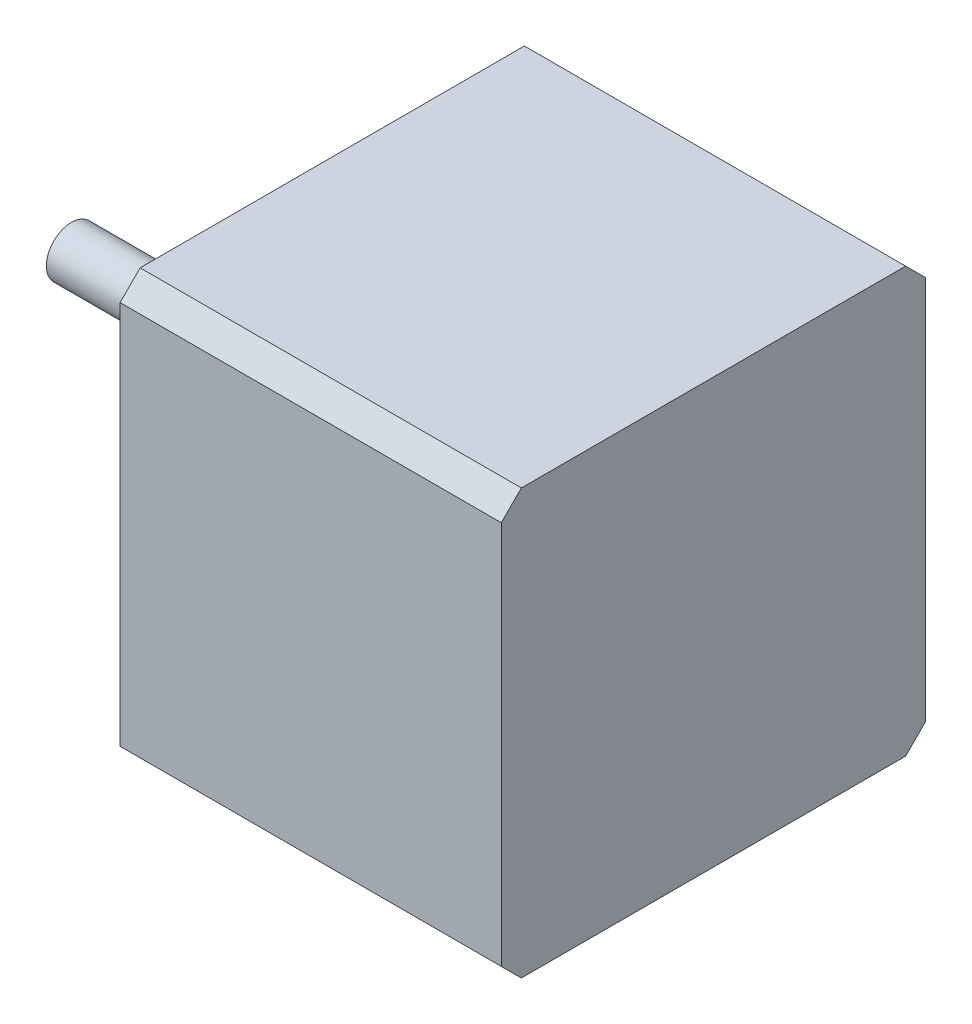
ISO-10303-21;
HEADER;
FILE_DESCRIPTION(('STEP AP214'),'2;1');
FILE_NAME('part.step','',(''),(''),'','','');
FILE_SCHEMA(('AUTOMOTIVE_DESIGN { 1 0 10303 214 1 1 1 1 }'));
ENDSEC;
DATA;
#1=APPLICATION_CONTEXT('core data for automotive mechanical design processes');
#2=APPLICATION_PROTOCOL_DEFINITION('international standard','automotive_design',2000,#1);
#3=PRODUCT_CONTEXT('',#1,'mechanical');
#4=PRODUCT('Part','Part','',(#3));
#5=PRODUCT_RELATED_PRODUCT_CATEGORY('part','',(#4));
#6=PRODUCT_DEFINITION_FORMATION('','',#4);
#7=PRODUCT_DEFINITION_CONTEXT('part definition',#1,'design');
#8=PRODUCT_DEFINITION('design','',#6,#7);
#9=PRODUCT_DEFINITION_SHAPE('','',#8);
#10=(LENGTH_UNIT() NAMED_UNIT(*) SI_UNIT(.MILLI.,.METRE.));
#11=(NAMED_UNIT(*) PLANE_ANGLE_UNIT() SI_UNIT($,.RADIAN.));
#12=(NAMED_UNIT(*) SI_UNIT($,.STERADIAN.) SOLID_ANGLE_UNIT());
#13=UNCERTAINTY_MEASURE_WITH_UNIT(LENGTH_MEASURE(1.E-05),#10,'distance_accuracy_value','');
#14=(GEOMETRIC_REPRESENTATION_CONTEXT(3) GLOBAL_UNCERTAINTY_ASSIGNED_CONTEXT((#13)) GLOBAL_UNIT_ASSIGNED_CONTEXT((#10,
#11,#12)) REPRESENTATION_CONTEXT('',''));
#15=CARTESIAN_POINT('',(0.,0.,0.));
#16=DIRECTION('',(0.,0.,1.));
#17=DIRECTION('',(1.,0.,0.));
#18=AXIS2_PLACEMENT_3D('',#15,#16,#17);
#19=CARTESIAN_POINT('',(38.,40.3,0.));
#20=DIRECTION('',(0.,0.707106781186547,0.707106781186548));
#21=DIRECTION('',(0.,-0.707106781186548,0.707106781186547));
#22=AXIS2_PLACEMENT_3D('',#19,#20,#21);
#23=PLANE('',#22);
#24=DIRECTION('',(0.,0.707106781186548,-0.707106781186547));
#25=VECTOR('',#24,1.);
#26=CARTESIAN_POINT('',(0.,40.3,0.));
#27=LINE('',#26,#25);
#28=CARTESIAN_POINT('',(0.,40.3,0.));
#29=VERTEX_POINT('',#28);
#30=CARTESIAN_POINT('',(0.,42.3,-2.));
#31=VERTEX_POINT('',#30);
#32=EDGE_CURVE('E133',#29,#31,#27,.T.);
#33=ORIENTED_EDGE('',*,*,#32,.F.);
#34=DIRECTION('',(-1.,0.,0.));
#35=VECTOR('',#34,1.);
#36=CARTESIAN_POINT('',(38.,40.3,0.));
#37=LINE('',#36,#35);
#38=CARTESIAN_POINT('',(38.,40.3,0.));
#39=VERTEX_POINT('',#38);
#40=EDGE_CURVE('E51',#39,#29,#37,.T.);
#41=ORIENTED_EDGE('',*,*,#40,.F.);
#42=DIRECTION('',(0.,0.707106781186548,-0.707106781186547));
#43=VECTOR('',#42,1.);
#44=CARTESIAN_POINT('',(38.,40.3,0.));
#45=LINE('',#44,#43);
#46=CARTESIAN_POINT('',(38.,42.3,-2.));
#47=VERTEX_POINT('',#46);
#48=EDGE_CURVE('E154',#39,#47,#45,.T.);
#49=ORIENTED_EDGE('',*,*,#48,.T.);
#50=DIRECTION('',(-1.,0.,0.));
#51=VECTOR('',#50,1.);
#52=CARTESIAN_POINT('',(38.,42.3,-2.));
#53=LINE('',#52,#51);
#54=EDGE_CURVE('E91',#47,#31,#53,.T.);
#55=ORIENTED_EDGE('',*,*,#54,.T.);
#56=EDGE_LOOP('',(#33,#41,#49,#55));
#57=FACE_BOUND('',#56,.T.);
#58=ADVANCED_FACE('F34',(#57),#23,.T.);
#59=CARTESIAN_POINT('',(38.,2.,0.));
#60=DIRECTION('',(0.,0.,1.));
#61=DIRECTION('',(1.,0.,0.));
#62=AXIS2_PLACEMENT_3D('',#59,#60,#61);
#63=PLANE('',#62);
#64=DIRECTION('',(0.,1.,0.));
#65=VECTOR('',#64,1.);
#66=CARTESIAN_POINT('',(0.,2.,0.));
#67=LINE('',#66,#65);
#68=CARTESIAN_POINT('',(0.,2.,0.));
#69=VERTEX_POINT('',#68);
#70=EDGE_CURVE('E151',#69,#29,#67,.T.);
#71=ORIENTED_EDGE('',*,*,#70,.F.);
#72=DIRECTION('',(-1.,0.,0.));
#73=VECTOR('',#72,1.);
#74=CARTESIAN_POINT('',(38.,2.,0.));
#75=LINE('',#74,#73);
#76=CARTESIAN_POINT('',(38.,2.,0.));
#77=VERTEX_POINT('',#76);
#78=EDGE_CURVE('E79',#77,#69,#75,.T.);
#79=ORIENTED_EDGE('',*,*,#78,.F.);
#80=DIRECTION('',(0.,1.,0.));
#81=VECTOR('',#80,1.);
#82=CARTESIAN_POINT('',(38.,2.,0.));
#83=LINE('',#82,#81);
#84=EDGE_CURVE('E113',#77,#39,#83,.T.);
#85=ORIENTED_EDGE('',*,*,#84,.T.);
#86=ORIENTED_EDGE('',*,*,#40,.T.);
#87=EDGE_LOOP('',(#71,#79,#85,#86));
#88=FACE_BOUND('',#87,.T.);
#89=ADVANCED_FACE('F185',(#88),#63,.T.);
#90=CARTESIAN_POINT('',(38.,2.,0.));
#91=DIRECTION('',(0.,0.707106781186548,-0.707106781186548));
#92=DIRECTION('',(0.,0.707106781186548,0.707106781186548));
#93=AXIS2_PLACEMENT_3D('',#90,#91,#92);
#94=PLANE('',#93);
#95=DIRECTION('',(0.,-0.707106781186548,-0.707106781186548));
#96=VECTOR('',#95,1.);
#97=CARTESIAN_POINT('',(0.,2.,0.));
#98=LINE('',#97,#96);
#99=CARTESIAN_POINT('',(0.,0.,-2.));
#100=VERTEX_POINT('',#99);
#101=EDGE_CURVE('E118',#69,#100,#98,.T.);
#102=ORIENTED_EDGE('',*,*,#101,.T.);
#103=DIRECTION('',(-1.,0.,0.));
#104=VECTOR('',#103,1.);
#105=CARTESIAN_POINT('',(38.,0.,-2.));
#106=LINE('',#105,#104);
#107=CARTESIAN_POINT('',(38.,0.,-2.));
#108=VERTEX_POINT('',#107);
#109=EDGE_CURVE('E116',#108,#100,#106,.T.);
#110=ORIENTED_EDGE('',*,*,#109,.F.);
#111=DIRECTION('',(0.,-0.707106781186548,-0.707106781186548));
#112=VECTOR('',#111,1.);
#113=CARTESIAN_POINT('',(38.,2.,0.));
#114=LINE('',#113,#112);
#115=EDGE_CURVE('E107',#77,#108,#114,.T.);
#116=ORIENTED_EDGE('',*,*,#115,.F.);
#117=ORIENTED_EDGE('',*,*,#78,.T.);
#118=EDGE_LOOP('',(#102,#110,#116,#117));
#119=FACE_BOUND('',#118,.T.);
#120=ADVANCED_FACE('F117',(#119),#94,.F.);
#121=CARTESIAN_POINT('',(38.,0.,-2.));
#122=DIRECTION('',(0.,1.,0.));
#123=DIRECTION('',(0.,0.,1.));
#124=AXIS2_PLACEMENT_3D('',#121,#122,#123);
#125=PLANE('',#124);
#126=DIRECTION('',(0.,0.,-1.));
#127=VECTOR('',#126,1.);
#128=CARTESIAN_POINT('',(0.,0.,-2.));
#129=LINE('',#128,#127);
#130=CARTESIAN_POINT('',(0.,0.,-40.3));
#131=VERTEX_POINT('',#130);
#132=EDGE_CURVE('E148',#100,#131,#129,.T.);
#133=ORIENTED_EDGE('',*,*,#132,.T.);
#134=DIRECTION('',(-1.,0.,0.));
#135=VECTOR('',#134,1.);
#136=CARTESIAN_POINT('',(38.,0.,-40.3));
#137=LINE('',#136,#135);
#138=CARTESIAN_POINT('',(38.,0.,-40.3));
#139=VERTEX_POINT('',#138);
#140=EDGE_CURVE('E121',#139,#131,#137,.T.);
#141=ORIENTED_EDGE('',*,*,#140,.F.);
#142=DIRECTION('',(0.,0.,-1.));
#143=VECTOR('',#142,1.);
#144=CARTESIAN_POINT('',(38.,0.,-2.));
#145=LINE('',#144,#143);
#146=EDGE_CURVE('E111',#108,#139,#145,.T.);
#147=ORIENTED_EDGE('',*,*,#146,.F.);
#148=ORIENTED_EDGE('',*,*,#109,.T.);
#149=EDGE_LOOP('',(#133,#141,#147,#148));
#150=FACE_BOUND('',#149,.T.);
#151=ADVANCED_FACE('F123',(#150),#125,.F.);
#152=CARTESIAN_POINT('',(38.,0.,-40.3));
#153=DIRECTION('',(0.,0.707106781186548,0.707106781186547));
#154=DIRECTION('',(0.,-0.707106781186547,0.707106781186548));
#155=AXIS2_PLACEMENT_3D('',#152,#153,#154);
#156=PLANE('',#155);
#157=DIRECTION('',(0.,0.707106781186547,-0.707106781186548));
#158=VECTOR('',#157,1.);
#159=CARTESIAN_POINT('',(0.,0.,-40.3));
#160=LINE('',#159,#158);
#161=CARTESIAN_POINT('',(0.,2.,-42.3));
#162=VERTEX_POINT('',#161);
#163=EDGE_CURVE('E146',#131,#162,#160,.T.);
#164=ORIENTED_EDGE('',*,*,#163,.T.);
#165=DIRECTION('',(-1.,0.,0.));
#166=VECTOR('',#165,1.);
#167=CARTESIAN_POINT('',(38.,2.,-42.3));
#168=LINE('',#167,#166);
#169=CARTESIAN_POINT('',(38.,2.,-42.3));
#170=VERTEX_POINT('',#169);
#171=EDGE_CURVE('E158',#170,#162,#168,.T.);
#172=ORIENTED_EDGE('',*,*,#171,.F.);
#173=DIRECTION('',(0.,0.707106781186547,-0.707106781186548));
#174=VECTOR('',#173,1.);
#175=CARTESIAN_POINT('',(38.,0.,-40.3));
#176=LINE('',#175,#174);
#177=EDGE_CURVE('E126',#139,#170,#176,.T.);
#178=ORIENTED_EDGE('',*,*,#177,.F.);
#179=ORIENTED_EDGE('',*,*,#140,.T.);
#180=EDGE_LOOP('',(#164,#172,#178,#179));
#181=FACE_BOUND('',#180,.T.);
#182=ADVANCED_FACE('F201',(#181),#156,.F.);
#183=CARTESIAN_POINT('',(38.,2.,-42.3));
#184=DIRECTION('',(0.,0.,1.));
#185=DIRECTION('',(1.,0.,0.));
#186=AXIS2_PLACEMENT_3D('',#183,#184,#185);
#187=PLANE('',#186);
#188=DIRECTION('',(0.,1.,0.));
#189=VECTOR('',#188,1.);
#190=CARTESIAN_POINT('',(0.,2.,-42.3));
#191=LINE('',#190,#189);
#192=CARTESIAN_POINT('',(0.,40.3,-42.3));
#193=VERTEX_POINT('',#192);
#194=EDGE_CURVE('E143',#162,#193,#191,.T.);
#195=ORIENTED_EDGE('',*,*,#194,.T.);
#196=DIRECTION('',(-1.,0.,0.));
#197=VECTOR('',#196,1.);
#198=CARTESIAN_POINT('',(38.,40.3,-42.3));
#199=LINE('',#198,#197);
#200=CARTESIAN_POINT('',(38.,40.3,-42.3));
#201=VERTEX_POINT('',#200);
#202=EDGE_CURVE('E161',#201,#193,#199,.T.);
#203=ORIENTED_EDGE('',*,*,#202,.F.);
#204=DIRECTION('',(0.,1.,0.));
#205=VECTOR('',#204,1.);
#206=CARTESIAN_POINT('',(38.,2.,-42.3));
#207=LINE('',#206,#205);
#208=EDGE_CURVE('E128',#170,#201,#207,.T.);
#209=ORIENTED_EDGE('',*,*,#208,.F.);
#210=ORIENTED_EDGE('',*,*,#171,.T.);
#211=EDGE_LOOP('',(#195,#203,#209,#210));
#212=FACE_BOUND('',#211,.T.);
#213=ADVANCED_FACE('F197',(#212),#187,.F.);
#214=CARTESIAN_POINT('',(38.,42.3,-40.3));
#215=DIRECTION('',(0.,0.707106781186548,-0.707106781186548));
#216=DIRECTION('',(0.,0.707106781186548,0.707106781186548));
#217=AXIS2_PLACEMENT_3D('',#214,#215,#216);
#218=PLANE('',#217);
#219=DIRECTION('',(0.,-0.707106781186547,-0.707106781186547));
#220=VECTOR('',#219,1.);
#221=CARTESIAN_POINT('',(0.,42.3,-40.3));
#222=LINE('',#221,#220);
#223=CARTESIAN_POINT('',(0.,42.3,-40.3));
#224=VERTEX_POINT('',#223);
#225=EDGE_CURVE('E140',#224,#193,#222,.T.);
#226=ORIENTED_EDGE('',*,*,#225,.F.);
#227=DIRECTION('',(-1.,0.,0.));
#228=VECTOR('',#227,1.);
#229=CARTESIAN_POINT('',(38.,42.3,-40.3));
#230=LINE('',#229,#228);
#231=CARTESIAN_POINT('',(38.,42.3,-40.3));
#232=VERTEX_POINT('',#231);
#233=EDGE_CURVE('E163',#232,#224,#230,.T.);
#234=ORIENTED_EDGE('',*,*,#233,.F.);
#235=DIRECTION('',(0.,-0.707106781186547,-0.707106781186547));
#236=VECTOR('',#235,1.);
#237=CARTESIAN_POINT('',(38.,42.3,-40.3));
#238=LINE('',#237,#236);
#239=EDGE_CURVE('E292',#232,#201,#238,.T.);
#240=ORIENTED_EDGE('',*,*,#239,.T.);
#241=ORIENTED_EDGE('',*,*,#202,.T.);
#242=EDGE_LOOP('',(#226,#234,#240,#241));
#243=FACE_BOUND('',#242,.T.);
#244=ADVANCED_FACE('F194',(#243),#218,.T.);
#245=CARTESIAN_POINT('',(38.,42.3,-2.));
#246=DIRECTION('',(0.,1.,0.));
#247=DIRECTION('',(0.,0.,1.));
#248=AXIS2_PLACEMENT_3D('',#245,#246,#247);
#249=PLANE('',#248);
#250=DIRECTION('',(0.,0.,-1.));
#251=VECTOR('',#250,1.);
#252=CARTESIAN_POINT('',(0.,42.3,-2.));
#253=LINE('',#252,#251);
#254=EDGE_CURVE('E136',#31,#224,#253,.T.);
#255=ORIENTED_EDGE('',*,*,#254,.F.);
#256=ORIENTED_EDGE('',*,*,#54,.F.);
#257=DIRECTION('',(0.,0.,-1.));
#258=VECTOR('',#257,1.);
#259=CARTESIAN_POINT('',(38.,42.3,-2.));
#260=LINE('',#259,#258);
#261=EDGE_CURVE('E290',#47,#232,#260,.T.);
#262=ORIENTED_EDGE('',*,*,#261,.T.);
#263=ORIENTED_EDGE('',*,*,#233,.T.);
#264=EDGE_LOOP('',(#255,#256,#262,#263));
#265=FACE_BOUND('',#264,.T.);
#266=ADVANCED_FACE('F191',(#265),#249,.T.);
#267=CARTESIAN_POINT('',(38.,0.,0.));
#268=DIRECTION('',(-1.,0.,0.));
#269=DIRECTION('',(0.,0.,1.));
#270=AXIS2_PLACEMENT_3D('',#267,#268,#269);
#271=PLANE('',#270);
#272=ORIENTED_EDGE('',*,*,#48,.F.);
#273=ORIENTED_EDGE('',*,*,#84,.F.);
#274=ORIENTED_EDGE('',*,*,#115,.T.);
#275=ORIENTED_EDGE('',*,*,#146,.T.);
#276=ORIENTED_EDGE('',*,*,#177,.T.);
#277=ORIENTED_EDGE('',*,*,#208,.T.);
#278=ORIENTED_EDGE('',*,*,#239,.F.);
#279=ORIENTED_EDGE('',*,*,#261,.F.);
#280=EDGE_LOOP('',(#272,#273,#274,#275,#276,#277,#278,#279));
#281=FACE_BOUND('',#280,.T.);
#282=ADVANCED_FACE('F109',(#281),#271,.F.);
#283=CARTESIAN_POINT('',(0.,0.,0.));
#284=DIRECTION('',(-1.,0.,0.));
#285=DIRECTION('',(0.,0.,1.));
#286=AXIS2_PLACEMENT_3D('',#283,#284,#285);
#287=PLANE('',#286);
#288=CARTESIAN_POINT('',(0.,5.65,-5.65));
#289=DIRECTION('',(-1.,0.,0.));
#290=DIRECTION('',(0.,0.,-1.));
#291=AXIS2_PLACEMENT_3D('',#288,#289,#290);
#292=CIRCLE('',#291,1.5);
#293=CARTESIAN_POINT('',(0.,5.65,-7.15));
#294=VERTEX_POINT('',#293);
#295=EDGE_CURVE('E259',#294,#294,#292,.T.);
#296=ORIENTED_EDGE('',*,*,#295,.F.);
#297=EDGE_LOOP('',(#296));
#298=FACE_BOUND('',#297,.T.);
#299=CARTESIAN_POINT('',(0.,5.65000000000015,-36.6500000000002));
#300=DIRECTION('',(-1.,0.,0.));
#301=DIRECTION('',(0.,1.,0.));
#302=AXIS2_PLACEMENT_3D('',#299,#300,#301);
#303=CIRCLE('',#302,1.5);
#304=CARTESIAN_POINT('',(0.,7.15000000000016,-36.6500000000001));
#305=VERTEX_POINT('',#304);
#306=EDGE_CURVE('E270',#305,#305,#303,.T.);
#307=ORIENTED_EDGE('',*,*,#306,.F.);
#308=EDGE_LOOP('',(#307));
#309=FACE_BOUND('',#308,.T.);
#310=CARTESIAN_POINT('',(0.,36.6499999999999,-5.64999999999994));
#311=DIRECTION('',(-1.,0.,0.));
#312=DIRECTION('',(0.,-1.,0.));
#313=AXIS2_PLACEMENT_3D('',#310,#311,#312);
#314=CIRCLE('',#313,1.5);
#315=CARTESIAN_POINT('',(0.,35.1499999999999,-5.64999999999995));
#316=VERTEX_POINT('',#315);
#317=EDGE_CURVE('E258',#316,#316,#314,.T.);
#318=ORIENTED_EDGE('',*,*,#317,.F.);
#319=EDGE_LOOP('',(#318));
#320=FACE_BOUND('',#319,.T.);
#321=CARTESIAN_POINT('',(0.,36.65,-36.65));
#322=DIRECTION('',(-1.,0.,0.));
#323=DIRECTION('',(0.,0.,1.));
#324=AXIS2_PLACEMENT_3D('',#321,#322,#323);
#325=CIRCLE('',#324,1.5);
#326=CARTESIAN_POINT('',(0.,36.65,-35.15));
#327=VERTEX_POINT('',#326);
#328=EDGE_CURVE('E274',#327,#327,#325,.T.);
#329=ORIENTED_EDGE('',*,*,#328,.F.);
#330=EDGE_LOOP('',(#329));
#331=FACE_BOUND('',#330,.T.);
#332=CARTESIAN_POINT('',(0.,21.15,-21.15));
#333=DIRECTION('',(-1.,0.,0.));
#334=DIRECTION('',(0.,0.,1.));
#335=AXIS2_PLACEMENT_3D('',#332,#333,#334);
#336=CIRCLE('',#335,11.);
#337=CARTESIAN_POINT('',(0.,21.15,-10.15));
#338=VERTEX_POINT('',#337);
#339=EDGE_CURVE('E137',#338,#338,#336,.T.);
#340=ORIENTED_EDGE('',*,*,#339,.F.);
#341=EDGE_LOOP('',(#340));
#342=FACE_BOUND('',#341,.T.);
#343=ORIENTED_EDGE('',*,*,#32,.T.);
#344=ORIENTED_EDGE('',*,*,#254,.T.);
#345=ORIENTED_EDGE('',*,*,#225,.T.);
#346=ORIENTED_EDGE('',*,*,#194,.F.);
#347=ORIENTED_EDGE('',*,*,#163,.F.);
#348=ORIENTED_EDGE('',*,*,#132,.F.);
#349=ORIENTED_EDGE('',*,*,#101,.F.);
#350=ORIENTED_EDGE('',*,*,#70,.T.);
#351=EDGE_LOOP('',(#343,#344,#345,#346,#347,#348,#349,#350));
#352=FACE_BOUND('',#351,.T.);
#353=ADVANCED_FACE('F210',(#298,#309,#320,#331,#342,#352),#287,.T.);
#354=CARTESIAN_POINT('',(-2.,21.15,-21.15));
#355=DIRECTION('',(1.,0.,0.));
#356=DIRECTION('',(0.,0.,-1.));
#357=AXIS2_PLACEMENT_3D('',#354,#355,#356);
#358=CYLINDRICAL_SURFACE('',#357,11.);
#359=CARTESIAN_POINT('',(-1.,21.15,-21.15));
#360=DIRECTION('',(-1.,0.,0.));
#361=DIRECTION('',(0.,0.,1.));
#362=AXIS2_PLACEMENT_3D('',#359,#360,#361);
#363=CIRCLE('',#362,11.);
#364=CARTESIAN_POINT('',(-1.,21.15,-10.15));
#365=VERTEX_POINT('',#364);
#366=EDGE_CURVE('E11',#365,#365,#363,.F.);
#367=ORIENTED_EDGE('',*,*,#366,.T.);
#368=EDGE_LOOP('',(#367));
#369=FACE_BOUND('',#368,.T.);
#370=ORIENTED_EDGE('',*,*,#339,.T.);
#371=EDGE_LOOP('',(#370));
#372=FACE_BOUND('',#371,.T.);
#373=ADVANCED_FACE('F180',(#369,#372),#358,.T.);
#374=CARTESIAN_POINT('',(-2.,21.15,-21.15));
#375=DIRECTION('',(-1.,0.,0.));
#376=DIRECTION('',(0.,0.,1.));
#377=AXIS2_PLACEMENT_3D('',#374,#375,#376);
#378=PLANE('',#377);
#379=CARTESIAN_POINT('',(-2.,21.15,-21.15));
#380=DIRECTION('',(-1.,0.,0.));
#381=DIRECTION('',(0.,0.,1.));
#382=AXIS2_PLACEMENT_3D('',#379,#380,#381);
#383=CIRCLE('',#382,2.5);
#384=CARTESIAN_POINT('',(-2.,21.15,-18.65));
#385=VERTEX_POINT('',#384);
#386=EDGE_CURVE('E279',#385,#385,#383,.T.);
#387=ORIENTED_EDGE('',*,*,#386,.F.);
#388=EDGE_LOOP('',(#387));
#389=FACE_BOUND('',#388,.T.);
#390=CARTESIAN_POINT('',(-2.,21.15,-21.15));
#391=DIRECTION('',(-1.,0.,0.));
#392=DIRECTION('',(0.,0.,1.));
#393=AXIS2_PLACEMENT_3D('',#390,#391,#392);
#394=CIRCLE('',#393,10.);
#395=CARTESIAN_POINT('',(-2.,21.15,-11.15));
#396=VERTEX_POINT('',#395);
#397=EDGE_CURVE('E43',#396,#396,#394,.T.);
#398=ORIENTED_EDGE('',*,*,#397,.T.);
#399=EDGE_LOOP('',(#398));
#400=FACE_BOUND('',#399,.T.);
#401=ADVANCED_FACE('F168',(#389,#400),#378,.T.);
#402=CARTESIAN_POINT('',(-1.,21.15,-21.15));
#403=DIRECTION('',(-1.,0.,0.));
#404=DIRECTION('',(0.,0.,1.));
#405=AXIS2_PLACEMENT_3D('',#402,#403,#404);
#406=TOROIDAL_SURFACE('',#405,10.,1.);
#407=ORIENTED_EDGE('',*,*,#366,.F.);
#408=EDGE_LOOP('',(#407));
#409=FACE_BOUND('',#408,.T.);
#410=ORIENTED_EDGE('',*,*,#397,.F.);
#411=EDGE_LOOP('',(#410));
#412=FACE_BOUND('',#411,.T.);
#413=ADVANCED_FACE('F36',(#409,#412),#406,.T.);
#414=CARTESIAN_POINT('',(-26.,21.15,-21.15));
#415=DIRECTION('',(1.,0.,0.));
#416=DIRECTION('',(0.,0.,-1.));
#417=AXIS2_PLACEMENT_3D('',#414,#415,#416);
#418=CYLINDRICAL_SURFACE('',#417,2.5);
#419=CARTESIAN_POINT('',(-26.,21.15,-21.15));
#420=DIRECTION('',(-1.,0.,0.));
#421=DIRECTION('',(0.,0.,1.));
#422=AXIS2_PLACEMENT_3D('',#419,#420,#421);
#423=CIRCLE('',#422,2.5);
#424=CARTESIAN_POINT('',(-26.,21.15,-18.65));
#425=VERTEX_POINT('',#424);
#426=EDGE_CURVE('E282',#425,#425,#423,.T.);
#427=ORIENTED_EDGE('',*,*,#426,.F.);
#428=EDGE_LOOP('',(#427));
#429=FACE_BOUND('',#428,.T.);
#430=ORIENTED_EDGE('',*,*,#386,.T.);
#431=EDGE_LOOP('',(#430));
#432=FACE_BOUND('',#431,.T.);
#433=ADVANCED_FACE('F171',(#429,#432),#418,.T.);
#434=CARTESIAN_POINT('',(-26.,21.15,-21.15));
#435=DIRECTION('',(-1.,0.,0.));
#436=DIRECTION('',(0.,0.,1.));
#437=AXIS2_PLACEMENT_3D('',#434,#435,#436);
#438=PLANE('',#437);
#439=ORIENTED_EDGE('',*,*,#426,.T.);
#440=EDGE_LOOP('',(#439));
#441=FACE_BOUND('',#440,.T.);
#442=ADVANCED_FACE('F177',(#441),#438,.T.);
#443=CARTESIAN_POINT('',(4.5,36.65,-36.65));
#444=DIRECTION('',(-1.,0.,0.));
#445=DIRECTION('',(0.,0.,1.));
#446=AXIS2_PLACEMENT_3D('',#443,#444,#445);
#447=CYLINDRICAL_SURFACE('',#446,1.5);
#448=CARTESIAN_POINT('',(4.5,36.65,-36.65));
#449=DIRECTION('',(-1.,0.,0.));
#450=DIRECTION('',(0.,0.,1.));
#451=AXIS2_PLACEMENT_3D('',#448,#449,#450);
#452=CIRCLE('',#451,1.5);
#453=CARTESIAN_POINT('',(4.5,36.65,-35.15));
#454=VERTEX_POINT('',#453);
#455=EDGE_CURVE('E276',#454,#454,#452,.T.);
#456=ORIENTED_EDGE('',*,*,#455,.F.);
#457=EDGE_LOOP('',(#456));
#458=FACE_BOUND('',#457,.T.);
#459=ORIENTED_EDGE('',*,*,#328,.T.);
#460=EDGE_LOOP('',(#459));
#461=FACE_BOUND('',#460,.T.);
#462=ADVANCED_FACE('F221',(#458,#461),#447,.F.);
#463=CARTESIAN_POINT('',(4.5,36.65,-36.65));
#464=DIRECTION('',(-1.,0.,0.));
#465=DIRECTION('',(0.,0.,1.));
#466=AXIS2_PLACEMENT_3D('',#463,#464,#465);
#467=PLANE('',#466);
#468=ORIENTED_EDGE('',*,*,#455,.T.);
#469=EDGE_LOOP('',(#468));
#470=FACE_BOUND('',#469,.T.);
#471=ADVANCED_FACE('F225',(#470),#467,.T.);
#472=CARTESIAN_POINT('',(4.5,36.6499999999999,-5.64999999999994));
#473=DIRECTION('',(-1.,0.,0.));
#474=DIRECTION('',(0.,0.,1.));
#475=AXIS2_PLACEMENT_3D('',#472,#473,#474);
#476=CYLINDRICAL_SURFACE('',#475,1.5);
#477=CARTESIAN_POINT('',(4.5,36.6499999999999,-5.64999999999994));
#478=DIRECTION('',(-1.,0.,0.));
#479=DIRECTION('',(0.,-1.,0.));
#480=AXIS2_PLACEMENT_3D('',#477,#478,#479);
#481=CIRCLE('',#480,1.5);
#482=CARTESIAN_POINT('',(4.5,35.1499999999999,-5.64999999999995));
#483=VERTEX_POINT('',#482);
#484=EDGE_CURVE('E262',#483,#483,#481,.T.);
#485=ORIENTED_EDGE('',*,*,#484,.F.);
#486=EDGE_LOOP('',(#485));
#487=FACE_BOUND('',#486,.T.);
#488=ORIENTED_EDGE('',*,*,#317,.T.);
#489=EDGE_LOOP('',(#488));
#490=FACE_BOUND('',#489,.T.);
#491=ADVANCED_FACE('F229',(#487,#490),#476,.F.);
#492=CARTESIAN_POINT('',(4.5,36.6499999999999,-5.64999999999994));
#493=DIRECTION('',(-1.,0.,0.));
#494=DIRECTION('',(0.,-1.,0.));
#495=AXIS2_PLACEMENT_3D('',#492,#493,#494);
#496=PLANE('',#495);
#497=ORIENTED_EDGE('',*,*,#484,.T.);
#498=EDGE_LOOP('',(#497));
#499=FACE_BOUND('',#498,.T.);
#500=ADVANCED_FACE('F233',(#499),#496,.T.);
#501=CARTESIAN_POINT('',(4.5,5.65000000000015,-36.6500000000002));
#502=DIRECTION('',(-1.,0.,0.));
#503=DIRECTION('',(0.,0.,1.));
#504=AXIS2_PLACEMENT_3D('',#501,#502,#503);
#505=CYLINDRICAL_SURFACE('',#504,1.5);
#506=CARTESIAN_POINT('',(4.5,5.65000000000015,-36.6500000000002));
#507=DIRECTION('',(-1.,0.,0.));
#508=DIRECTION('',(0.,1.,0.));
#509=AXIS2_PLACEMENT_3D('',#506,#507,#508);
#510=CIRCLE('',#509,1.5);
#511=CARTESIAN_POINT('',(4.5,7.15000000000016,-36.6500000000001));
#512=VERTEX_POINT('',#511);
#513=EDGE_CURVE('E265',#512,#512,#510,.T.);
#514=ORIENTED_EDGE('',*,*,#513,.F.);
#515=EDGE_LOOP('',(#514));
#516=FACE_BOUND('',#515,.T.);
#517=ORIENTED_EDGE('',*,*,#306,.T.);
#518=EDGE_LOOP('',(#517));
#519=FACE_BOUND('',#518,.T.);
#520=ADVANCED_FACE('F237',(#516,#519),#505,.F.);
#521=CARTESIAN_POINT('',(4.5,5.65000000000015,-36.6500000000002));
#522=DIRECTION('',(-1.,0.,0.));
#523=DIRECTION('',(0.,1.,0.));
#524=AXIS2_PLACEMENT_3D('',#521,#522,#523);
#525=PLANE('',#524);
#526=ORIENTED_EDGE('',*,*,#513,.T.);
#527=EDGE_LOOP('',(#526));
#528=FACE_BOUND('',#527,.T.);
#529=ADVANCED_FACE('F241',(#528),#525,.T.);
#530=CARTESIAN_POINT('',(4.5,5.65,-5.65));
#531=DIRECTION('',(-1.,0.,0.));
#532=DIRECTION('',(0.,0.,1.));
#533=AXIS2_PLACEMENT_3D('',#530,#531,#532);
#534=CYLINDRICAL_SURFACE('',#533,1.5);
#535=CARTESIAN_POINT('',(4.5,5.65,-5.65));
#536=DIRECTION('',(-1.,0.,0.));
#537=DIRECTION('',(0.,0.,-1.));
#538=AXIS2_PLACEMENT_3D('',#535,#536,#537);
#539=CIRCLE('',#538,1.5);
#540=CARTESIAN_POINT('',(4.5,5.65,-7.15));
#541=VERTEX_POINT('',#540);
#542=EDGE_CURVE('E257',#541,#541,#539,.T.);
#543=ORIENTED_EDGE('',*,*,#542,.F.);
#544=EDGE_LOOP('',(#543));
#545=FACE_BOUND('',#544,.T.);
#546=ORIENTED_EDGE('',*,*,#295,.T.);
#547=EDGE_LOOP('',(#546));
#548=FACE_BOUND('',#547,.T.);
#549=ADVANCED_FACE('F245',(#545,#548),#534,.F.);
#550=CARTESIAN_POINT('',(4.5,5.65,-5.65));
#551=DIRECTION('',(-1.,0.,0.));
#552=DIRECTION('',(0.,0.,-1.));
#553=AXIS2_PLACEMENT_3D('',#550,#551,#552);
#554=PLANE('',#553);
#555=ORIENTED_EDGE('',*,*,#542,.T.);
#556=EDGE_LOOP('',(#555));
#557=FACE_BOUND('',#556,.T.);
#558=ADVANCED_FACE('F249',(#557),#554,.T.);
#559=CLOSED_SHELL('',(#58,#89,#120,#151,#182,#213,#244,#266,#282,#353,#373,#401,#413,#433,#442,
#462,#471,#491,#500,#520,#529,#549,#558));
#560=MANIFOLD_SOLID_BREP('B2',#559);
#561=ADVANCED_BREP_SHAPE_REPRESENTATION('',(#18,#560),#14);
#562=SHAPE_DEFINITION_REPRESENTATION(#9,#561);
ENDSEC;
END-ISO-10303-21;
